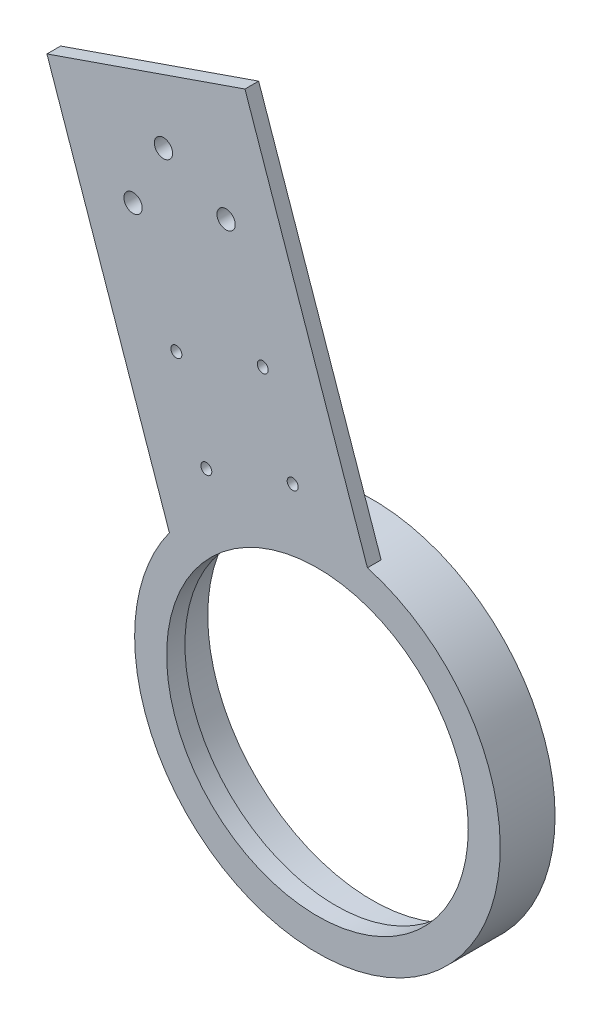
ISO-10303-21;
HEADER;
FILE_DESCRIPTION(('STEP AP214'),'2;1');
FILE_NAME('part.step','',(''),(''),'','','');
FILE_SCHEMA(('AUTOMOTIVE_DESIGN { 1 0 10303 214 1 1 1 1 }'));
ENDSEC;
DATA;
#1=APPLICATION_CONTEXT('core data for automotive mechanical design processes');
#2=APPLICATION_PROTOCOL_DEFINITION('international standard','automotive_design',2000,#1);
#3=PRODUCT_CONTEXT('',#1,'mechanical');
#4=PRODUCT('Part','Part','',(#3));
#5=PRODUCT_RELATED_PRODUCT_CATEGORY('part','',(#4));
#6=PRODUCT_DEFINITION_FORMATION('','',#4);
#7=PRODUCT_DEFINITION_CONTEXT('part definition',#1,'design');
#8=PRODUCT_DEFINITION('design','',#6,#7);
#9=PRODUCT_DEFINITION_SHAPE('','',#8);
#10=(LENGTH_UNIT() NAMED_UNIT(*) SI_UNIT(.MILLI.,.METRE.));
#11=(NAMED_UNIT(*) PLANE_ANGLE_UNIT() SI_UNIT($,.RADIAN.));
#12=(NAMED_UNIT(*) SI_UNIT($,.STERADIAN.) SOLID_ANGLE_UNIT());
#13=UNCERTAINTY_MEASURE_WITH_UNIT(LENGTH_MEASURE(1.E-05),#10,'distance_accuracy_value','');
#14=(GEOMETRIC_REPRESENTATION_CONTEXT(3) GLOBAL_UNCERTAINTY_ASSIGNED_CONTEXT((#13)) GLOBAL_UNIT_ASSIGNED_CONTEXT((#10,
#11,#12)) REPRESENTATION_CONTEXT('',''));
#15=CARTESIAN_POINT('',(0.,0.,0.));
#16=DIRECTION('',(0.,0.,1.));
#17=DIRECTION('',(1.,0.,0.));
#18=AXIS2_PLACEMENT_3D('',#15,#16,#17);
#19=CARTESIAN_POINT('',(-86.606649797073,-63.7835303855202,0.));
#20=DIRECTION('',(0.,0.,1.));
#21=DIRECTION('',(1.,0.,0.));
#22=AXIS2_PLACEMENT_3D('',#19,#20,#21);
#23=PLANE('',#22);
#24=CARTESIAN_POINT('',(-86.606649797073,-63.7835303855202,0.));
#25=DIRECTION('',(0.,0.,1.));
#26=DIRECTION('',(1.,0.,0.));
#27=AXIS2_PLACEMENT_3D('',#24,#25,#26);
#28=CIRCLE('',#27,32.9999999999998);
#29=CARTESIAN_POINT('',(-53.6066497970732,-63.7835303855202,0.));
#30=VERTEX_POINT('',#29);
#31=EDGE_CURVE('E122',#30,#30,#28,.T.);
#32=ORIENTED_EDGE('',*,*,#31,.T.);
#33=EDGE_LOOP('',(#32));
#34=FACE_BOUND('',#33,.T.);
#35=CARTESIAN_POINT('',(-86.6066497970745,-63.7835303855214,0.));
#36=DIRECTION('',(0.,0.,-1.));
#37=DIRECTION('',(-1.,0.,0.));
#38=AXIS2_PLACEMENT_3D('',#35,#36,#37);
#39=CIRCLE('',#38,36.0000000000021);
#40=CARTESIAN_POINT('',(-122.606649797077,-63.7835303855214,0.));
#41=VERTEX_POINT('',#40);
#42=EDGE_CURVE('E112',#41,#41,#39,.T.);
#43=ORIENTED_EDGE('',*,*,#42,.T.);
#44=EDGE_LOOP('',(#43));
#45=FACE_BOUND('',#44,.T.);
#46=ADVANCED_FACE('F41',(#34,#45),#23,.F.);
#47=CARTESIAN_POINT('',(-86.606649797073,-63.7835303855202,4.));
#48=DIRECTION('',(0.,0.,1.));
#49=DIRECTION('',(1.,0.,0.));
#50=AXIS2_PLACEMENT_3D('',#47,#48,#49);
#51=PLANE('',#50);
#52=CARTESIAN_POINT('',(-117.474470723547,-5.24815968333653,4.));
#53=DIRECTION('',(0.,0.,1.));
#54=DIRECTION('',(1.,0.,0.));
#55=AXIS2_PLACEMENT_3D('',#52,#53,#54);
#56=CIRCLE('',#55,1.2);
#57=CARTESIAN_POINT('',(-116.274470723547,-5.24815968333653,4.));
#58=VERTEX_POINT('',#57);
#59=EDGE_CURVE('E137',#58,#58,#56,.T.);
#60=ORIENTED_EDGE('',*,*,#59,.F.);
#61=EDGE_LOOP('',(#60));
#62=FACE_BOUND('',#61,.T.);
#63=CARTESIAN_POINT('',(-110.925868002898,-24.1456675192156,4.));
#64=DIRECTION('',(0.,0.,1.));
#65=DIRECTION('',(1.,0.,0.));
#66=AXIS2_PLACEMENT_3D('',#63,#64,#65);
#67=CIRCLE('',#66,1.2);
#68=CARTESIAN_POINT('',(-109.725868002898,-24.1456675192156,4.));
#69=VERTEX_POINT('',#68);
#70=EDGE_CURVE('E171',#69,#69,#67,.T.);
#71=ORIENTED_EDGE('',*,*,#70,.F.);
#72=EDGE_LOOP('',(#71));
#73=FACE_BOUND('',#72,.T.);
#74=CARTESIAN_POINT('',(-98.5769628876678,1.30044303731236,4.));
#75=DIRECTION('',(0.,0.,1.));
#76=DIRECTION('',(1.,0.,0.));
#77=AXIS2_PLACEMENT_3D('',#74,#75,#76);
#78=CIRCLE('',#77,1.2);
#79=CARTESIAN_POINT('',(-97.3769628876678,1.30044303731236,4.));
#80=VERTEX_POINT('',#79);
#81=EDGE_CURVE('E168',#80,#80,#78,.T.);
#82=ORIENTED_EDGE('',*,*,#81,.F.);
#83=EDGE_LOOP('',(#82));
#84=FACE_BOUND('',#83,.T.);
#85=CARTESIAN_POINT('',(-92.0283601670189,-17.5970647985667,4.));
#86=DIRECTION('',(0.,0.,1.));
#87=DIRECTION('',(1.,0.,0.));
#88=AXIS2_PLACEMENT_3D('',#85,#86,#87);
#89=CIRCLE('',#88,1.2);
#90=CARTESIAN_POINT('',(-90.8283601670189,-17.5970647985667,4.));
#91=VERTEX_POINT('',#90);
#92=EDGE_CURVE('E165',#91,#91,#89,.T.);
#93=ORIENTED_EDGE('',*,*,#92,.F.);
#94=EDGE_LOOP('',(#93));
#95=FACE_BOUND('',#94,.T.);
#96=CARTESIAN_POINT('',(-120.302459734684,31.9164331121324,4.));
#97=DIRECTION('',(0.,0.,-1.));
#98=DIRECTION('',(-1.,0.,0.));
#99=AXIS2_PLACEMENT_3D('',#96,#97,#98);
#100=CIRCLE('',#99,2.);
#101=CARTESIAN_POINT('',(-122.302459734684,31.9164331121324,4.));
#102=VERTEX_POINT('',#101);
#103=EDGE_CURVE('E109',#102,#102,#100,.T.);
#104=ORIENTED_EDGE('',*,*,#103,.T.);
#105=EDGE_LOOP('',(#104));
#106=FACE_BOUND('',#105,.T.);
#107=CARTESIAN_POINT('',(-126.956233045713,18.2056911709531,4.));
#108=DIRECTION('',(0.,0.,-1.));
#109=DIRECTION('',(-1.,0.,0.));
#110=AXIS2_PLACEMENT_3D('',#107,#108,#109);
#111=CIRCLE('',#110,2.00000000000002);
#112=CARTESIAN_POINT('',(-128.956233045713,18.2056911709531,4.));
#113=VERTEX_POINT('',#112);
#114=EDGE_CURVE('E152',#113,#113,#111,.T.);
#115=ORIENTED_EDGE('',*,*,#114,.T.);
#116=EDGE_LOOP('',(#115));
#117=FACE_BOUND('',#116,.T.);
#118=CARTESIAN_POINT('',(-106.591717793505,25.2626598011038,4.));
#119=DIRECTION('',(0.,0.,-1.));
#120=DIRECTION('',(-1.,0.,0.));
#121=AXIS2_PLACEMENT_3D('',#118,#119,#120);
#122=CIRCLE('',#121,2.00000000000001);
#123=CARTESIAN_POINT('',(-108.591717793505,25.2626598011038,4.));
#124=VERTEX_POINT('',#123);
#125=EDGE_CURVE('E144',#124,#124,#122,.T.);
#126=ORIENTED_EDGE('',*,*,#125,.T.);
#127=EDGE_LOOP('',(#126));
#128=FACE_BOUND('',#127,.T.);
#129=CARTESIAN_POINT('',(-86.606649797073,-63.7835303855202,4.));
#130=DIRECTION('',(0.,0.,1.));
#131=DIRECTION('',(1.,0.,0.));
#132=AXIS2_PLACEMENT_3D('',#129,#130,#131);
#133=CIRCLE('',#132,40.);
#134=CARTESIAN_POINT('',(-119.004205290731,-40.3229592493491,4.));
#135=VERTEX_POINT('',#134);
#136=CARTESIAN_POINT('',(-75.6723049719823,-25.3070427177767,4.));
#137=VERTEX_POINT('',#136);
#138=EDGE_CURVE('E126',#135,#137,#133,.T.);
#139=ORIENTED_EDGE('',*,*,#138,.T.);
#140=DIRECTION('',(-0.327430136032445,0.944875391793952,0.));
#141=VECTOR('',#140,1.);
#142=CARTESIAN_POINT('',(-102.470674132793,52.0258499324921,4.));
#143=LINE('',#142,#141);
#144=CARTESIAN_POINT('',(-102.470674132793,52.0258499324921,4.));
#145=VERTEX_POINT('',#144);
#146=EDGE_CURVE('E107',#137,#145,#143,.T.);
#147=ORIENTED_EDGE('',*,*,#146,.T.);
#148=DIRECTION('',(-0.944875391793953,-0.327430136032443,0.));
#149=VECTOR('',#148,1.);
#150=CARTESIAN_POINT('',(-102.470674132793,52.0258499324921,4.));
#151=LINE('',#150,#149);
#152=CARTESIAN_POINT('',(-145.802574451543,37.0099334009222,4.));
#153=VERTEX_POINT('',#152);
#154=EDGE_CURVE('E98',#145,#153,#151,.T.);
#155=ORIENTED_EDGE('',*,*,#154,.T.);
#156=DIRECTION('',(0.327430136032443,-0.944875391793953,0.));
#157=VECTOR('',#156,1.);
#158=CARTESIAN_POINT('',(-145.802574451543,37.0099334009222,4.));
#159=LINE('',#158,#157);
#160=EDGE_CURVE('E58',#153,#135,#159,.T.);
#161=ORIENTED_EDGE('',*,*,#160,.T.);
#162=EDGE_LOOP('',(#139,#147,#155,#161));
#163=FACE_BOUND('',#162,.T.);
#164=CARTESIAN_POINT('',(-86.606649797073,-63.7835303855202,4.));
#165=DIRECTION('',(0.,0.,1.));
#166=DIRECTION('',(1.,0.,0.));
#167=AXIS2_PLACEMENT_3D('',#164,#165,#166);
#168=CIRCLE('',#167,32.9999999999998);
#169=CARTESIAN_POINT('',(-53.6066497970732,-63.7835303855202,4.));
#170=VERTEX_POINT('',#169);
#171=EDGE_CURVE('E123',#170,#170,#168,.T.);
#172=ORIENTED_EDGE('',*,*,#171,.F.);
#173=EDGE_LOOP('',(#172));
#174=FACE_BOUND('',#173,.T.);
#175=ADVANCED_FACE('F179',(#62,#73,#84,#95,#106,#117,#128,#163,#174),#51,.T.);
#176=CARTESIAN_POINT('',(-86.606649797073,-63.7835303855202,4.));
#177=DIRECTION('',(0.,0.,-1.));
#178=DIRECTION('',(-1.,0.,0.));
#179=AXIS2_PLACEMENT_3D('',#176,#177,#178);
#180=CYLINDRICAL_SURFACE('',#179,40.);
#181=CARTESIAN_POINT('',(-86.606649797073,-63.7835303855202,1.));
#182=DIRECTION('',(0.,0.,-1.));
#183=DIRECTION('',(-1.,0.,0.));
#184=AXIS2_PLACEMENT_3D('',#181,#182,#183);
#185=CIRCLE('',#184,40.);
#186=CARTESIAN_POINT('',(-119.004205290731,-40.3229592493491,1.));
#187=VERTEX_POINT('',#186);
#188=CARTESIAN_POINT('',(-75.6723049719823,-25.3070427177767,1.));
#189=VERTEX_POINT('',#188);
#190=EDGE_CURVE('E66',#187,#189,#185,.T.);
#191=ORIENTED_EDGE('',*,*,#190,.T.);
#192=DIRECTION('',(0.,0.,-1.));
#193=VECTOR('',#192,1.);
#194=CARTESIAN_POINT('',(-75.6723049719823,-25.3070427177767,4.));
#195=LINE('',#194,#193);
#196=EDGE_CURVE('E11',#189,#137,#195,.F.);
#197=ORIENTED_EDGE('',*,*,#196,.T.);
#198=ORIENTED_EDGE('',*,*,#138,.F.);
#199=DIRECTION('',(0.,0.,-1.));
#200=VECTOR('',#199,1.);
#201=CARTESIAN_POINT('',(-119.004205290731,-40.3229592493491,4.));
#202=LINE('',#201,#200);
#203=EDGE_CURVE('E50',#135,#187,#202,.T.);
#204=ORIENTED_EDGE('',*,*,#203,.T.);
#205=EDGE_LOOP('',(#191,#197,#198,#204));
#206=FACE_BOUND('',#205,.T.);
#207=CARTESIAN_POINT('',(-86.6066497970745,-63.7835303855214,-8.));
#208=DIRECTION('',(0.,0.,-1.));
#209=DIRECTION('',(-1.,0.,0.));
#210=AXIS2_PLACEMENT_3D('',#207,#208,#209);
#211=CIRCLE('',#210,40.0000000000014);
#212=CARTESIAN_POINT('',(-126.606649797076,-63.7835303855214,-8.));
#213=VERTEX_POINT('',#212);
#214=EDGE_CURVE('E117',#213,#213,#211,.T.);
#215=ORIENTED_EDGE('',*,*,#214,.F.);
#216=EDGE_LOOP('',(#215));
#217=FACE_BOUND('',#216,.T.);
#218=ADVANCED_FACE('F43',(#206,#217),#180,.T.);
#219=CARTESIAN_POINT('',(-86.606649797073,-63.7835303855202,4.));
#220=DIRECTION('',(0.,0.,-1.));
#221=DIRECTION('',(-1.,0.,0.));
#222=AXIS2_PLACEMENT_3D('',#219,#220,#221);
#223=CYLINDRICAL_SURFACE('',#222,32.9999999999998);
#224=ORIENTED_EDGE('',*,*,#171,.T.);
#225=EDGE_LOOP('',(#224));
#226=FACE_BOUND('',#225,.T.);
#227=ORIENTED_EDGE('',*,*,#31,.F.);
#228=EDGE_LOOP('',(#227));
#229=FACE_BOUND('',#228,.T.);
#230=ADVANCED_FACE('F196',(#226,#229),#223,.F.);
#231=CARTESIAN_POINT('',(-86.6066497970745,-63.7835303855214,-8.));
#232=DIRECTION('',(0.,0.,-1.));
#233=DIRECTION('',(-1.,0.,0.));
#234=AXIS2_PLACEMENT_3D('',#231,#232,#233);
#235=PLANE('',#234);
#236=ORIENTED_EDGE('',*,*,#214,.T.);
#237=EDGE_LOOP('',(#236));
#238=FACE_BOUND('',#237,.T.);
#239=CARTESIAN_POINT('',(-86.6066497970745,-63.7835303855214,-8.));
#240=DIRECTION('',(0.,0.,-1.));
#241=DIRECTION('',(-1.,0.,0.));
#242=AXIS2_PLACEMENT_3D('',#239,#240,#241);
#243=CIRCLE('',#242,36.0000000000021);
#244=CARTESIAN_POINT('',(-122.606649797077,-63.7835303855214,-8.));
#245=VERTEX_POINT('',#244);
#246=EDGE_CURVE('E114',#245,#245,#243,.T.);
#247=ORIENTED_EDGE('',*,*,#246,.F.);
#248=EDGE_LOOP('',(#247));
#249=FACE_BOUND('',#248,.T.);
#250=ADVANCED_FACE('F199',(#238,#249),#235,.T.);
#251=CARTESIAN_POINT('',(-86.6066497970745,-63.7835303855214,-8.));
#252=DIRECTION('',(0.,0.,1.));
#253=DIRECTION('',(1.,0.,0.));
#254=AXIS2_PLACEMENT_3D('',#251,#252,#253);
#255=CYLINDRICAL_SURFACE('',#254,36.0000000000021);
#256=ORIENTED_EDGE('',*,*,#246,.T.);
#257=EDGE_LOOP('',(#256));
#258=FACE_BOUND('',#257,.T.);
#259=ORIENTED_EDGE('',*,*,#42,.F.);
#260=EDGE_LOOP('',(#259));
#261=FACE_BOUND('',#260,.T.);
#262=ADVANCED_FACE('F207',(#258,#261),#255,.F.);
#263=CARTESIAN_POINT('',(-102.470674132793,52.0258499324921,1.));
#264=DIRECTION('',(0.944875391793952,0.327430136032445,0.));
#265=DIRECTION('',(-0.327430136032445,0.944875391793952,0.));
#266=AXIS2_PLACEMENT_3D('',#263,#264,#265);
#267=PLANE('',#266);
#268=ORIENTED_EDGE('',*,*,#196,.F.);
#269=DIRECTION('',(-0.327430136032445,0.944875391793952,0.));
#270=VECTOR('',#269,1.);
#271=CARTESIAN_POINT('',(-102.470674132793,52.0258499324921,1.));
#272=LINE('',#271,#270);
#273=CARTESIAN_POINT('',(-102.470674132793,52.0258499324921,1.));
#274=VERTEX_POINT('',#273);
#275=EDGE_CURVE('E87',#189,#274,#272,.T.);
#276=ORIENTED_EDGE('',*,*,#275,.T.);
#277=DIRECTION('',(0.,0.,1.));
#278=VECTOR('',#277,1.);
#279=CARTESIAN_POINT('',(-102.470674132793,52.0258499324921,1.));
#280=LINE('',#279,#278);
#281=EDGE_CURVE('E90',#274,#145,#280,.T.);
#282=ORIENTED_EDGE('',*,*,#281,.T.);
#283=ORIENTED_EDGE('',*,*,#146,.F.);
#284=EDGE_LOOP('',(#268,#276,#282,#283));
#285=FACE_BOUND('',#284,.T.);
#286=ADVANCED_FACE('F89',(#285),#267,.T.);
#287=CARTESIAN_POINT('',(-145.802574451543,37.0099334009222,1.));
#288=DIRECTION('',(-0.944875391793953,-0.327430136032443,0.));
#289=DIRECTION('',(0.327430136032443,-0.944875391793953,0.));
#290=AXIS2_PLACEMENT_3D('',#287,#288,#289);
#291=PLANE('',#290);
#292=ORIENTED_EDGE('',*,*,#203,.F.);
#293=ORIENTED_EDGE('',*,*,#160,.F.);
#294=DIRECTION('',(0.,0.,1.));
#295=VECTOR('',#294,1.);
#296=CARTESIAN_POINT('',(-145.802574451543,37.0099334009222,1.));
#297=LINE('',#296,#295);
#298=CARTESIAN_POINT('',(-145.802574451543,37.0099334009222,1.));
#299=VERTEX_POINT('',#298);
#300=EDGE_CURVE('E99',#299,#153,#297,.T.);
#301=ORIENTED_EDGE('',*,*,#300,.F.);
#302=DIRECTION('',(0.327430136032443,-0.944875391793953,0.));
#303=VECTOR('',#302,1.);
#304=CARTESIAN_POINT('',(-145.802574451543,37.0099334009222,1.));
#305=LINE('',#304,#303);
#306=EDGE_CURVE('E100',#299,#187,#305,.T.);
#307=ORIENTED_EDGE('',*,*,#306,.T.);
#308=EDGE_LOOP('',(#292,#293,#301,#307));
#309=FACE_BOUND('',#308,.T.);
#310=ADVANCED_FACE('F216',(#309),#291,.T.);
#311=CARTESIAN_POINT('',(-102.470674132793,52.0258499324921,1.));
#312=DIRECTION('',(-0.327430136032443,0.944875391793953,0.));
#313=DIRECTION('',(-0.944875391793953,-0.327430136032443,0.));
#314=AXIS2_PLACEMENT_3D('',#311,#312,#313);
#315=PLANE('',#314);
#316=ORIENTED_EDGE('',*,*,#154,.F.);
#317=ORIENTED_EDGE('',*,*,#281,.F.);
#318=DIRECTION('',(-0.944875391793953,-0.327430136032443,0.));
#319=VECTOR('',#318,1.);
#320=CARTESIAN_POINT('',(-102.470674132793,52.0258499324921,1.));
#321=LINE('',#320,#319);
#322=EDGE_CURVE('E93',#274,#299,#321,.T.);
#323=ORIENTED_EDGE('',*,*,#322,.T.);
#324=ORIENTED_EDGE('',*,*,#300,.T.);
#325=EDGE_LOOP('',(#316,#317,#323,#324));
#326=FACE_BOUND('',#325,.T.);
#327=ADVANCED_FACE('F97',(#326),#315,.T.);
#328=CARTESIAN_POINT('',(-86.6066497970745,-63.7835303855214,1.));
#329=DIRECTION('',(0.,0.,-1.));
#330=DIRECTION('',(-1.,0.,0.));
#331=AXIS2_PLACEMENT_3D('',#328,#329,#330);
#332=PLANE('',#331);
#333=CARTESIAN_POINT('',(-117.474470723547,-5.24815968333653,1.));
#334=DIRECTION('',(0.,0.,-1.));
#335=DIRECTION('',(-1.,0.,0.));
#336=AXIS2_PLACEMENT_3D('',#333,#334,#335);
#337=CIRCLE('',#336,1.2);
#338=CARTESIAN_POINT('',(-118.674470723547,-5.24815968333653,1.));
#339=VERTEX_POINT('',#338);
#340=EDGE_CURVE('E45',#339,#339,#337,.T.);
#341=ORIENTED_EDGE('',*,*,#340,.F.);
#342=EDGE_LOOP('',(#341));
#343=FACE_BOUND('',#342,.T.);
#344=CARTESIAN_POINT('',(-110.925868002898,-24.1456675192156,1.));
#345=DIRECTION('',(0.,0.,-1.));
#346=DIRECTION('',(-1.,0.,0.));
#347=AXIS2_PLACEMENT_3D('',#344,#345,#346);
#348=CIRCLE('',#347,1.2);
#349=CARTESIAN_POINT('',(-112.125868002898,-24.1456675192156,1.));
#350=VERTEX_POINT('',#349);
#351=EDGE_CURVE('E139',#350,#350,#348,.T.);
#352=ORIENTED_EDGE('',*,*,#351,.F.);
#353=EDGE_LOOP('',(#352));
#354=FACE_BOUND('',#353,.T.);
#355=CARTESIAN_POINT('',(-98.5769628876678,1.30044303731236,1.));
#356=DIRECTION('',(0.,0.,-1.));
#357=DIRECTION('',(-1.,0.,0.));
#358=AXIS2_PLACEMENT_3D('',#355,#356,#357);
#359=CIRCLE('',#358,1.2);
#360=CARTESIAN_POINT('',(-99.7769628876678,1.30044303731236,1.));
#361=VERTEX_POINT('',#360);
#362=EDGE_CURVE('E136',#361,#361,#359,.T.);
#363=ORIENTED_EDGE('',*,*,#362,.F.);
#364=EDGE_LOOP('',(#363));
#365=FACE_BOUND('',#364,.T.);
#366=CARTESIAN_POINT('',(-92.0283601670189,-17.5970647985667,1.));
#367=DIRECTION('',(0.,0.,-1.));
#368=DIRECTION('',(-1.,0.,0.));
#369=AXIS2_PLACEMENT_3D('',#366,#367,#368);
#370=CIRCLE('',#369,1.2);
#371=CARTESIAN_POINT('',(-93.2283601670189,-17.5970647985667,1.));
#372=VERTEX_POINT('',#371);
#373=EDGE_CURVE('E133',#372,#372,#370,.T.);
#374=ORIENTED_EDGE('',*,*,#373,.F.);
#375=EDGE_LOOP('',(#374));
#376=FACE_BOUND('',#375,.T.);
#377=CARTESIAN_POINT('',(-120.302459734684,31.9164331121324,1.));
#378=DIRECTION('',(0.,0.,-1.));
#379=DIRECTION('',(-1.,0.,0.));
#380=AXIS2_PLACEMENT_3D('',#377,#378,#379);
#381=CIRCLE('',#380,2.);
#382=CARTESIAN_POINT('',(-122.302459734684,31.9164331121324,1.));
#383=VERTEX_POINT('',#382);
#384=EDGE_CURVE('E160',#383,#383,#381,.T.);
#385=ORIENTED_EDGE('',*,*,#384,.F.);
#386=EDGE_LOOP('',(#385));
#387=FACE_BOUND('',#386,.T.);
#388=CARTESIAN_POINT('',(-126.956233045713,18.2056911709531,1.));
#389=DIRECTION('',(0.,0.,-1.));
#390=DIRECTION('',(-1.,0.,0.));
#391=AXIS2_PLACEMENT_3D('',#388,#389,#390);
#392=CIRCLE('',#391,2.00000000000002);
#393=CARTESIAN_POINT('',(-128.956233045713,18.2056911709531,1.));
#394=VERTEX_POINT('',#393);
#395=EDGE_CURVE('E157',#394,#394,#392,.T.);
#396=ORIENTED_EDGE('',*,*,#395,.F.);
#397=EDGE_LOOP('',(#396));
#398=FACE_BOUND('',#397,.T.);
#399=CARTESIAN_POINT('',(-106.591717793505,25.2626598011038,1.));
#400=DIRECTION('',(0.,0.,-1.));
#401=DIRECTION('',(-1.,0.,0.));
#402=AXIS2_PLACEMENT_3D('',#399,#400,#401);
#403=CIRCLE('',#402,2.00000000000001);
#404=CARTESIAN_POINT('',(-108.591717793505,25.2626598011038,1.));
#405=VERTEX_POINT('',#404);
#406=EDGE_CURVE('E148',#405,#405,#403,.T.);
#407=ORIENTED_EDGE('',*,*,#406,.F.);
#408=EDGE_LOOP('',(#407));
#409=FACE_BOUND('',#408,.T.);
#410=ORIENTED_EDGE('',*,*,#190,.F.);
#411=ORIENTED_EDGE('',*,*,#306,.F.);
#412=ORIENTED_EDGE('',*,*,#322,.F.);
#413=ORIENTED_EDGE('',*,*,#275,.F.);
#414=EDGE_LOOP('',(#410,#411,#412,#413));
#415=FACE_BOUND('',#414,.T.);
#416=ADVANCED_FACE('F102',(#343,#354,#365,#376,#387,#398,#409,#415),#332,.T.);
#417=CARTESIAN_POINT('',(-106.591717793505,25.2626598011038,4.));
#418=DIRECTION('',(0.,0.,-1.));
#419=DIRECTION('',(-1.,0.,0.));
#420=AXIS2_PLACEMENT_3D('',#417,#418,#419);
#421=CYLINDRICAL_SURFACE('',#420,2.00000000000001);
#422=ORIENTED_EDGE('',*,*,#125,.F.);
#423=EDGE_LOOP('',(#422));
#424=FACE_BOUND('',#423,.T.);
#425=ORIENTED_EDGE('',*,*,#406,.T.);
#426=EDGE_LOOP('',(#425));
#427=FACE_BOUND('',#426,.T.);
#428=ADVANCED_FACE('F228',(#424,#427),#421,.F.);
#429=CARTESIAN_POINT('',(-126.956233045713,18.2056911709531,4.));
#430=DIRECTION('',(0.,0.,-1.));
#431=DIRECTION('',(-1.,0.,0.));
#432=AXIS2_PLACEMENT_3D('',#429,#430,#431);
#433=CYLINDRICAL_SURFACE('',#432,2.00000000000002);
#434=ORIENTED_EDGE('',*,*,#114,.F.);
#435=EDGE_LOOP('',(#434));
#436=FACE_BOUND('',#435,.T.);
#437=ORIENTED_EDGE('',*,*,#395,.T.);
#438=EDGE_LOOP('',(#437));
#439=FACE_BOUND('',#438,.T.);
#440=ADVANCED_FACE('F232',(#436,#439),#433,.F.);
#441=CARTESIAN_POINT('',(-120.302459734684,31.9164331121324,4.));
#442=DIRECTION('',(0.,0.,-1.));
#443=DIRECTION('',(-1.,0.,0.));
#444=AXIS2_PLACEMENT_3D('',#441,#442,#443);
#445=CYLINDRICAL_SURFACE('',#444,2.);
#446=ORIENTED_EDGE('',*,*,#103,.F.);
#447=EDGE_LOOP('',(#446));
#448=FACE_BOUND('',#447,.T.);
#449=ORIENTED_EDGE('',*,*,#384,.T.);
#450=EDGE_LOOP('',(#449));
#451=FACE_BOUND('',#450,.T.);
#452=ADVANCED_FACE('F236',(#448,#451),#445,.F.);
#453=CARTESIAN_POINT('',(-92.0283601670189,-17.5970647985667,-1.));
#454=DIRECTION('',(0.,0.,1.));
#455=DIRECTION('',(1.,0.,0.));
#456=AXIS2_PLACEMENT_3D('',#453,#454,#455);
#457=CYLINDRICAL_SURFACE('',#456,1.2);
#458=ORIENTED_EDGE('',*,*,#373,.T.);
#459=EDGE_LOOP('',(#458));
#460=FACE_BOUND('',#459,.T.);
#461=ORIENTED_EDGE('',*,*,#92,.T.);
#462=EDGE_LOOP('',(#461));
#463=FACE_BOUND('',#462,.T.);
#464=ADVANCED_FACE('F240',(#460,#463),#457,.F.);
#465=CARTESIAN_POINT('',(-98.5769628876678,1.30044303731236,-1.));
#466=DIRECTION('',(0.,0.,1.));
#467=DIRECTION('',(1.,0.,0.));
#468=AXIS2_PLACEMENT_3D('',#465,#466,#467);
#469=CYLINDRICAL_SURFACE('',#468,1.2);
#470=ORIENTED_EDGE('',*,*,#362,.T.);
#471=EDGE_LOOP('',(#470));
#472=FACE_BOUND('',#471,.T.);
#473=ORIENTED_EDGE('',*,*,#81,.T.);
#474=EDGE_LOOP('',(#473));
#475=FACE_BOUND('',#474,.T.);
#476=ADVANCED_FACE('F244',(#472,#475),#469,.F.);
#477=CARTESIAN_POINT('',(-110.925868002898,-24.1456675192156,-1.));
#478=DIRECTION('',(0.,0.,1.));
#479=DIRECTION('',(1.,0.,0.));
#480=AXIS2_PLACEMENT_3D('',#477,#478,#479);
#481=CYLINDRICAL_SURFACE('',#480,1.2);
#482=ORIENTED_EDGE('',*,*,#351,.T.);
#483=EDGE_LOOP('',(#482));
#484=FACE_BOUND('',#483,.T.);
#485=ORIENTED_EDGE('',*,*,#70,.T.);
#486=EDGE_LOOP('',(#485));
#487=FACE_BOUND('',#486,.T.);
#488=ADVANCED_FACE('F248',(#484,#487),#481,.F.);
#489=CARTESIAN_POINT('',(-117.474470723547,-5.24815968333653,-1.));
#490=DIRECTION('',(0.,0.,1.));
#491=DIRECTION('',(1.,0.,0.));
#492=AXIS2_PLACEMENT_3D('',#489,#490,#491);
#493=CYLINDRICAL_SURFACE('',#492,1.2);
#494=ORIENTED_EDGE('',*,*,#340,.T.);
#495=EDGE_LOOP('',(#494));
#496=FACE_BOUND('',#495,.T.);
#497=ORIENTED_EDGE('',*,*,#59,.T.);
#498=EDGE_LOOP('',(#497));
#499=FACE_BOUND('',#498,.T.);
#500=ADVANCED_FACE('F177',(#496,#499),#493,.F.);
#501=CLOSED_SHELL('',(#46,#175,#218,#230,#250,#262,#286,#310,#327,#416,#428,#440,#452,#464,#476,
#488,#500));
#502=MANIFOLD_SOLID_BREP('B2',#501);
#503=ADVANCED_BREP_SHAPE_REPRESENTATION('',(#18,#502),#14);
#504=SHAPE_DEFINITION_REPRESENTATION(#9,#503);
ENDSEC;
END-ISO-10303-21;
